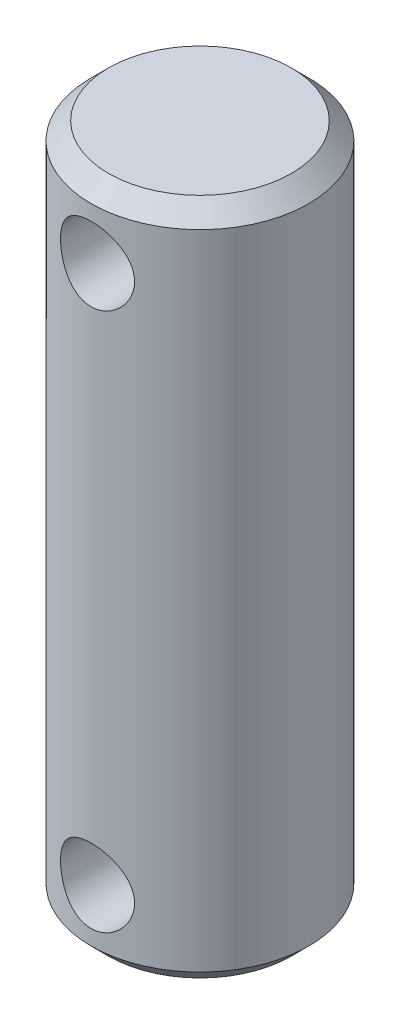
ISO-10303-21;
HEADER;
FILE_DESCRIPTION(('STEP AP214'),'2;1');
FILE_NAME('part.step','',(''),(''),'','','');
FILE_SCHEMA(('AUTOMOTIVE_DESIGN { 1 0 10303 214 1 1 1 1 }'));
ENDSEC;
DATA;
#1=APPLICATION_CONTEXT('core data for automotive mechanical design processes');
#2=APPLICATION_PROTOCOL_DEFINITION('international standard','automotive_design',2000,#1);
#3=PRODUCT_CONTEXT('',#1,'mechanical');
#4=PRODUCT('Part','Part','',(#3));
#5=PRODUCT_RELATED_PRODUCT_CATEGORY('part','',(#4));
#6=PRODUCT_DEFINITION_FORMATION('','',#4);
#7=PRODUCT_DEFINITION_CONTEXT('part definition',#1,'design');
#8=PRODUCT_DEFINITION('design','',#6,#7);
#9=PRODUCT_DEFINITION_SHAPE('','',#8);
#10=(LENGTH_UNIT() NAMED_UNIT(*) SI_UNIT(.MILLI.,.METRE.));
#11=(NAMED_UNIT(*) PLANE_ANGLE_UNIT() SI_UNIT($,.RADIAN.));
#12=(NAMED_UNIT(*) SI_UNIT($,.STERADIAN.) SOLID_ANGLE_UNIT());
#13=UNCERTAINTY_MEASURE_WITH_UNIT(LENGTH_MEASURE(1.E-05),#10,'distance_accuracy_value','');
#14=(GEOMETRIC_REPRESENTATION_CONTEXT(3) GLOBAL_UNCERTAINTY_ASSIGNED_CONTEXT((#13)) GLOBAL_UNIT_ASSIGNED_CONTEXT((#10,
#11,#12)) REPRESENTATION_CONTEXT('',''));
#15=CARTESIAN_POINT('',(0.,0.,0.));
#16=DIRECTION('',(0.,0.,1.));
#17=DIRECTION('',(1.,0.,0.));
#18=AXIS2_PLACEMENT_3D('',#15,#16,#17);
#19=CARTESIAN_POINT('',(0.,38.91,0.));
#20=DIRECTION('',(0.,-1.,0.));
#21=DIRECTION('',(0.,0.,-1.));
#22=AXIS2_PLACEMENT_3D('',#19,#20,#21);
#23=CYLINDRICAL_SURFACE('',#22,12.5);
#24=CARTESIAN_POINT('',(0.,35.16,-12.5));
#25=CARTESIAN_POINT('',(-0.231629316585797,35.1600020330341,-12.5000013493631));
#26=CARTESIAN_POINT('',(-0.463244602260156,35.1410026670462,-12.493502868787));
#27=CARTESIAN_POINT('',(-0.919637198733394,35.0657510509299,-12.4682205879803));
#28=CARTESIAN_POINT('',(-1.14441406994913,35.0094964112488,-12.4494359997198));
#29=CARTESIAN_POINT('',(-1.58048439723264,34.8618965380055,-12.4016188733298));
#30=CARTESIAN_POINT('',(-1.79180021823001,34.770611378287,-12.3726038861914));
#31=CARTESIAN_POINT('',(-2.1961203899874,34.5558184811844,-12.3072763657775));
#32=CARTESIAN_POINT('',(-2.38912089291743,34.4323039931499,-12.270962304028));
#33=CARTESIAN_POINT('',(-2.75825261944735,34.1519106918981,-12.1933910285169));
#34=CARTESIAN_POINT('',(-2.93363688121843,33.9940824421219,-12.1520119725704));
#35=CARTESIAN_POINT('',(-3.25602333800847,33.6515597009182,-12.069633438027));
#36=CARTESIAN_POINT('',(-3.40301894005995,33.4668589860642,-12.0286340497037));
#37=CARTESIAN_POINT('',(-3.66879190776175,33.0690227206061,-11.9503048632061));
#38=CARTESIAN_POINT('',(-3.78658554363525,32.8551980705236,-11.9131228611846));
#39=CARTESIAN_POINT('',(-3.98421855180598,32.409305339374,-11.8484975327096));
#40=CARTESIAN_POINT('',(-4.06407004270031,32.1772431109649,-11.8210510974587));
#41=CARTESIAN_POINT('',(-4.180727158555,31.7099754672721,-11.7802904138908));
#42=CARTESIAN_POINT('',(-4.21893677153849,31.4751618601511,-11.7665167255043));
#43=CARTESIAN_POINT('',(-4.2556150496915,31.0020834933359,-11.7533040945085));
#44=CARTESIAN_POINT('',(-4.25409658909983,30.7638198766629,-11.7538605081001));
#45=CARTESIAN_POINT('',(-4.21244934024964,30.3027050541706,-11.7688435667819));
#46=CARTESIAN_POINT('',(-4.1741694203804,30.0796614961546,-11.7826060062583));
#47=CARTESIAN_POINT('',(-4.06310816523945,29.643374512476,-11.8213609901718));
#48=CARTESIAN_POINT('',(-3.99032254229152,29.4301323083421,-11.8463549302143));
#49=CARTESIAN_POINT('',(-3.81113653039608,29.0153676287839,-11.9052184288415));
#50=CARTESIAN_POINT('',(-3.70419900732798,28.8140979714414,-11.9392282253861));
#51=CARTESIAN_POINT('',(-3.46011773998614,28.4317829261275,-12.0122344758094));
#52=CARTESIAN_POINT('',(-3.3229649914025,28.2507435911989,-12.0512324147271));
#53=CARTESIAN_POINT('',(-3.01353124215082,27.903661489716,-12.1324166416207));
#54=CARTESIAN_POINT('',(-2.83974395035441,27.7389723564576,-12.1746609041245));
#55=CARTESIAN_POINT('',(-2.4665017699171,27.440714672255,-12.2557250188891));
#56=CARTESIAN_POINT('',(-2.26704421977735,27.307149352277,-12.294544515365));
#57=CARTESIAN_POINT('',(-1.84516436753421,27.0737817200249,-12.3649312356261));
#58=CARTESIAN_POINT('',(-1.62251944687187,26.9743554382244,-12.3964165316577));
#59=CARTESIAN_POINT('',(-1.16233553494295,26.8147926289126,-12.4479909440337));
#60=CARTESIAN_POINT('',(-0.924801969927403,26.7546418774178,-12.4680841857644));
#61=CARTESIAN_POINT('',(-0.453032806948608,26.6777666520223,-12.4939206883818));
#62=CARTESIAN_POINT('',(-0.219127772365222,26.6592140835185,-12.5002675966187));
#63=CARTESIAN_POINT('',(0.248508234272233,26.6608366933351,-12.499715139365));
#64=CARTESIAN_POINT('',(0.482239229767981,26.6810050341146,-12.4928181125577));
#65=CARTESIAN_POINT('',(0.935487055917024,26.7580582339634,-12.4669514589193));
#66=CARTESIAN_POINT('',(1.15521999196989,26.8138095457653,-12.4483547937561));
#67=CARTESIAN_POINT('',(1.58211571473707,26.959017457826,-12.4013331971436));
#68=CARTESIAN_POINT('',(1.78927688332145,27.048478386259,-12.3729070036624));
#69=CARTESIAN_POINT('',(2.19135854363444,27.2612234537794,-12.3081499547371));
#70=CARTESIAN_POINT('',(2.38580051143911,27.385351890635,-12.2716272117682));
#71=CARTESIAN_POINT('',(2.75168306551547,27.6629228847875,-12.1948041286534));
#72=CARTESIAN_POINT('',(2.92311635003781,27.8163747105205,-12.1545025961777));
#73=CARTESIAN_POINT('',(3.24657351287904,28.1568275664985,-12.0722386132383));
#74=CARTESIAN_POINT('',(3.39729328842666,28.345073487899,-12.0302879182072));
#75=CARTESIAN_POINT('',(3.66518020873976,28.7450778779993,-11.9514023496921));
#76=CARTESIAN_POINT('',(3.78234674334563,28.9568367741812,-11.914467567428));
#77=CARTESIAN_POINT('',(3.97933669538634,29.3981566802981,-11.8501336294714));
#78=CARTESIAN_POINT('',(4.05920753889126,29.627694646285,-11.8227223748612));
#79=CARTESIAN_POINT('',(4.1787762904475,30.0981175672848,-11.7809981443993));
#80=CARTESIAN_POINT('',(4.21849327320324,30.3389970776366,-11.7666789496003));
#81=CARTESIAN_POINT('',(4.2551029021973,30.8114252701727,-11.7534862510052));
#82=CARTESIAN_POINT('',(4.2541688433069,31.042785450644,-11.7538288765012));
#83=CARTESIAN_POINT('',(4.21488538095235,31.5018665676405,-11.7679720866019));
#84=CARTESIAN_POINT('',(4.17653837981658,31.7295877368765,-11.781771807111));
#85=CARTESIAN_POINT('',(4.06508169516974,32.1702486699102,-11.8206793925214));
#86=CARTESIAN_POINT('',(3.99270334550051,32.3833961386628,-11.8455487968498));
#87=CARTESIAN_POINT('',(3.81583792726954,32.7946811689962,-11.9036971533386));
#88=CARTESIAN_POINT('',(3.71134355482286,32.9928153034268,-11.9369780181425));
#89=CARTESIAN_POINT('',(3.46772073523882,33.3781337048613,-12.0100690469571));
#90=CARTESIAN_POINT('',(3.32724348872325,33.5644218744554,-12.0501058971147));
#91=CARTESIAN_POINT('',(3.0178925601542,33.9114819910172,-12.1312763731794));
#92=CARTESIAN_POINT('',(2.84901069833453,34.072246561876,-12.1724103121393));
#93=CARTESIAN_POINT('',(2.4793015879225,34.3703796450803,-12.2531734329683));
#94=CARTESIAN_POINT('',(2.2774454476222,34.5065125530158,-12.2926709568964));
#95=CARTESIAN_POINT('',(1.85239769842136,34.7427805226005,-12.3638575017702));
#96=CARTESIAN_POINT('',(1.62921053671336,34.8429230670564,-12.3955481454238));
#97=CARTESIAN_POINT('',(1.1749855410373,35.0011995465962,-12.4466848305204));
#98=CARTESIAN_POINT('',(0.944413374480445,35.0605523489214,-12.4664836857426));
#99=CARTESIAN_POINT('',(0.475887689244039,35.1399455427374,-12.4931386057906));
#100=CARTESIAN_POINT('',(0.237936441911583,35.1599979116076,-12.4999986138946));
#101=CARTESIAN_POINT('',(0.,35.16,-12.5));
#102=B_SPLINE_CURVE_WITH_KNOTS('',3,(#24,#25,#26,#27,#28,#29,#30,#31,#32,#33,#34,#35,#36,#37,
#38,#39,#40,#41,#42,#43,#44,#45,#46,#47,#48,#49,#50,#51,#52,#53,#54,#55,#56,#57,#58,#59,#60,#61,
#62,#63,#64,#65,#66,#67,#68,#69,#70,#71,#72,#73,#74,#75,#76,#77,#78,#79,#80,#81,#82,#83,#84,#85,
#86,#87,#88,#89,#90,#91,#92,#93,#94,#95,#96,#97,#98,#99,#100,#101),.UNSPECIFIED.,.T.,.F.,(4,2,2,
2,2,2,2,2,2,2,2,2,2,2,2,2,2,2,2,2,2,2,2,2,2,2,2,2,2,2,2,2,2,2,2,2,2,2,4),(0.,0.694012031135522,
1.38806858050573,2.08094017307814,2.77395700894338,3.48937549744916,4.20495993509719,
4.94210626785765,5.67901699996315,6.39023024980915,7.10121302747361,7.77821403353031,
8.45529918574264,9.14360628251112,9.83211877686468,10.558127208264,11.2842109731308,
12.0180534127162,12.7516299370932,13.4522781499046,14.1528026499667,14.8320547208526,
15.5113940346079,16.2089885679879,16.9068039604599,17.6376748123879,18.368558954226,
19.0985111385898,19.8281164030437,20.5187658396099,21.2093709316938,21.8857695188883,
22.5623220478608,23.2693695244284,23.976620961389,24.7129879656022,25.4492017820333,
26.1623287080454,26.8752382644273),.UNSPECIFIED.);
#103=CARTESIAN_POINT('',(0.,35.16,-12.5));
#104=VERTEX_POINT('',#103);
#105=EDGE_CURVE('E48',#104,#104,#102,.T.);
#106=ORIENTED_EDGE('',*,*,#105,.T.);
#107=EDGE_LOOP('',(#106));
#108=FACE_BOUND('',#107,.T.);
#109=CARTESIAN_POINT('',(4.25,30.91,11.7553179455087));
#110=CARTESIAN_POINT('',(4.25000208635938,30.6788082243958,11.7553163048564));
#111=CARTESIAN_POINT('',(4.23107177309128,30.4476306111017,11.7622127031611));
#112=CARTESIAN_POINT('',(4.15611937649357,29.9921430943685,11.7889024426549));
#113=CARTESIAN_POINT('',(4.10009241001671,29.7678340991343,11.8086974817267));
#114=CARTESIAN_POINT('',(3.95315727615972,29.3327597886088,11.8586887228588));
#115=CARTESIAN_POINT('',(3.86231972243053,29.1219680573483,11.8888638561852));
#116=CARTESIAN_POINT('',(3.64858465717113,28.7185451145788,11.9561841704273));
#117=CARTESIAN_POINT('',(3.52567963418154,28.5259181723876,11.9933309838111));
#118=CARTESIAN_POINT('',(3.24593667986677,28.1564478386544,12.0721055733369));
#119=CARTESIAN_POINT('',(3.08801191357713,27.9804516300864,12.1138482614208));
#120=CARTESIAN_POINT('',(2.74502977872382,27.6568608782459,12.1961419607755));
#121=CARTESIAN_POINT('',(2.55996786105974,27.5092711064602,12.2366927708767));
#122=CARTESIAN_POINT('',(2.16173358215593,27.242803063851,12.3133695834904));
#123=CARTESIAN_POINT('',(1.9479322684075,27.1248175164114,12.3493447648353));
#124=CARTESIAN_POINT('',(1.50208314069309,26.9268239888865,12.4114588114545));
#125=CARTESIAN_POINT('',(1.27004047751297,26.8468053327207,12.4376004414402));
#126=CARTESIAN_POINT('',(0.803181808925198,26.729904815012,12.4762877361144));
#127=CARTESIAN_POINT('',(0.568768024092832,26.691570565411,12.4892899687544));
#128=CARTESIAN_POINT('',(0.096498681332753,26.6545035304582,12.5018568685094));
#129=CARTESIAN_POINT('',(-0.141355937364764,26.6557601346843,12.5014251359524));
#130=CARTESIAN_POINT('',(-0.603455244429959,26.6969293778599,12.4874792686763));
#131=CARTESIAN_POINT('',(-0.827859366125013,26.7352633639397,12.474499409838));
#132=CARTESIAN_POINT('',(-1.26683563867679,26.8468817672938,12.4375910854643));
#133=CARTESIAN_POINT('',(-1.48140711554011,26.9201685765457,12.4136618706201));
#134=CARTESIAN_POINT('',(-1.8980164033555,27.1005041300386,12.3568751775078));
#135=CARTESIAN_POINT('',(-2.09984758406958,27.2079923868106,12.3239022889639));
#136=CARTESIAN_POINT('',(-2.48306659203639,27.4533137607319,12.2524460502634));
#137=CARTESIAN_POINT('',(-2.66444855405648,27.591155550554,12.2139611262977));
#138=CARTESIAN_POINT('',(-3.01099992399038,27.9011745301492,12.1333048225972));
#139=CARTESIAN_POINT('',(-3.17494418986543,28.0747002678062,12.0910451976412));
#140=CARTESIAN_POINT('',(-3.4718123267595,28.447127612344,12.0091752957356));
#141=CARTESIAN_POINT('',(-3.60473100646118,28.6460334573203,11.969565462949));
#142=CARTESIAN_POINT('',(-3.83756473071074,29.0675999287105,11.8969851778806));
#143=CARTESIAN_POINT('',(-3.93694148373781,29.2905784989992,11.8641260508176));
#144=CARTESIAN_POINT('',(-4.09631339640206,29.751505720852,11.8100543141711));
#145=CARTESIAN_POINT('',(-4.15632586418346,29.9894477426114,11.7888365866345));
#146=CARTESIAN_POINT('',(-4.23272709729825,30.461640096284,11.7616154920121));
#147=CARTESIAN_POINT('',(-4.25102291540232,30.6955435602831,11.7549476419358));
#148=CARTESIAN_POINT('',(-4.24888913268011,31.163124045222,11.7557200468072));
#149=CARTESIAN_POINT('',(-4.22846693505826,31.3968011009053,11.7631576046845));
#150=CARTESIAN_POINT('',(-4.15119312232908,31.8484588804628,11.790638359865));
#151=CARTESIAN_POINT('',(-4.09568855042672,32.0667015418879,11.8102149538794));
#152=CARTESIAN_POINT('',(-3.9514537893724,32.4907242875293,11.8592485003546));
#153=CARTESIAN_POINT('',(-3.86271756175014,32.6965020988783,11.888707248384));
#154=CARTESIAN_POINT('',(-3.65124748009679,33.0972093806727,11.9553766913527));
#155=CARTESIAN_POINT('',(-3.52749746510955,33.2915646574045,11.9928092351957));
#156=CARTESIAN_POINT('',(-3.25065304738288,33.6574387202912,12.0707872460142));
#157=CARTESIAN_POINT('',(-3.09754966045709,33.8289504874256,12.1113336637695));
#158=CARTESIAN_POINT('',(-2.75718975144257,34.1532047947156,12.1934414759765));
#159=CARTESIAN_POINT('',(-2.56860120561712,34.3045664440502,12.2349510943746));
#160=CARTESIAN_POINT('',(-2.16767839127811,34.5735958933644,12.3123024299383));
#161=CARTESIAN_POINT('',(-1.9553448608948,34.6912647403048,12.3481443232058));
#162=CARTESIAN_POINT('',(-1.51390748124952,34.8885220351902,12.4099713333259));
#163=CARTESIAN_POINT('',(-1.28491760269165,34.9683455126643,12.4360170721838));
#164=CARTESIAN_POINT('',(-0.81569900239732,35.0880013666957,12.4755748071516));
#165=CARTESIAN_POINT('',(-0.575474556193985,35.1278488293486,12.489091531298));
#166=CARTESIAN_POINT('',(-0.103211830111089,35.1650209742181,12.50169717107));
#167=CARTESIAN_POINT('',(0.128654421017074,35.1643244388139,12.501457487594));
#168=CARTESIAN_POINT('',(0.588812496753035,35.1253415064129,12.4882452162174));
#169=CARTESIAN_POINT('',(0.817104629585829,35.087058369155,12.4752737324961));
#170=CARTESIAN_POINT('',(1.25973733436524,34.9753164091026,12.438311718123));
#171=CARTESIAN_POINT('',(1.47424962273104,34.9024696892469,12.4145132190251));
#172=CARTESIAN_POINT('',(1.88808156366101,34.7242408217571,12.3583495347409));
#173=CARTESIAN_POINT('',(2.08739842506849,34.6188527146591,12.3259827805629));
#174=CARTESIAN_POINT('',(2.47341490547125,34.3739468867196,12.2544776933187));
#175=CARTESIAN_POINT('',(2.65935109194141,34.2332880355071,12.2151293747917));
#176=CARTESIAN_POINT('',(3.0056225058322,33.9237518219909,12.1345744052391));
#177=CARTESIAN_POINT('',(3.16594936631593,33.7548652740194,12.0933671524889));
#178=CARTESIAN_POINT('',(3.46317770167238,33.3853569274188,12.0117094140378));
#179=CARTESIAN_POINT('',(3.59884229876753,33.1837145025818,11.9713600094017));
#180=CARTESIAN_POINT('',(3.83428262236864,32.7592278836957,11.8980483180312));
#181=CARTESIAN_POINT('',(3.93406590564969,32.5363881664128,11.865084476414));
#182=CARTESIAN_POINT('',(4.0917578844551,32.0829356054837,11.8116162303556));
#183=CARTESIAN_POINT('',(4.15089676108841,31.8527949668864,11.7907491035731));
#184=CARTESIAN_POINT('',(4.23000923378121,31.3850959809143,11.7626034107323));
#185=CARTESIAN_POINT('',(4.24999785634727,31.1475405150521,11.7553196312149));
#186=CARTESIAN_POINT('',(4.25,30.91,11.7553179455087));
#187=B_SPLINE_CURVE_WITH_KNOTS('',3,(#109,#110,#111,#112,#113,#114,#115,#116,#117,#118,#119,
#120,#121,#122,#123,#124,#125,#126,#127,#128,#129,#130,#131,#132,#133,#134,#135,#136,#137,#138,
#139,#140,#141,#142,#143,#144,#145,#146,#147,#148,#149,#150,#151,#152,#153,#154,#155,#156,#157,
#158,#159,#160,#161,#162,#163,#164,#165,#166,#167,#168,#169,#170,#171,#172,#173,#174,#175,#176,
#177,#178,#179,#180,#181,#182,#183,#184,#185,#186),.UNSPECIFIED.,.T.,.F.,(4,2,2,2,2,2,2,2,2,2,2,
2,2,2,2,2,2,2,2,2,2,2,2,2,2,2,2,2,2,2,2,2,2,2,2,2,2,2,4),(0.,0.692694920384618,1.38548104047712,
2.07686921235574,2.76841948009047,3.48554525708903,4.20279138623515,4.93959691860359,
5.67619514235265,6.38621339082408,7.09604135470939,7.77691942027095,8.45784408804076,
9.14789875658826,9.83815084536889,10.5621283168264,11.2862268402086,12.0214474433795,
12.7563445591683,13.456908323454,14.1573381476705,14.8323840278356,15.5075526290563,
16.2047830406201,16.9022271951569,17.6348081128836,18.3673662641226,19.0953134364972,
19.8229857936747,20.515174766614,21.2073037140138,21.8876085563469,22.5680380602091,
23.2742297793021,23.9806517515895,24.7161707244756,25.4515347027242,26.1635249917672,
26.8752419537226),.UNSPECIFIED.);
#188=CARTESIAN_POINT('',(4.25,30.91,11.7553179455087));
#189=VERTEX_POINT('',#188);
#190=EDGE_CURVE('E108',#189,#189,#187,.T.);
#191=ORIENTED_EDGE('',*,*,#190,.T.);
#192=EDGE_LOOP('',(#191));
#193=FACE_BOUND('',#192,.T.);
#194=CARTESIAN_POINT('',(0.,-26.66,-12.5));
#195=CARTESIAN_POINT('',(-0.231629316585798,-26.6599979669659,-12.5000013493631));
#196=CARTESIAN_POINT('',(-0.463244602260157,-26.6789973329538,-12.493502868787));
#197=CARTESIAN_POINT('',(-0.919637198733394,-26.7542489490701,-12.4682205879803));
#198=CARTESIAN_POINT('',(-1.14441406994913,-26.8105035887512,-12.4494359997198));
#199=CARTESIAN_POINT('',(-1.58048439723264,-26.9581034619945,-12.4016188733298));
#200=CARTESIAN_POINT('',(-1.79180021823001,-27.049388621713,-12.3726038861914));
#201=CARTESIAN_POINT('',(-2.1961203899874,-27.2641815188156,-12.3072763657775));
#202=CARTESIAN_POINT('',(-2.38912089291743,-27.3876960068501,-12.270962304028));
#203=CARTESIAN_POINT('',(-2.75825261944734,-27.6680893081019,-12.1933910285169));
#204=CARTESIAN_POINT('',(-2.93363688121842,-27.8259175578781,-12.1520119725704));
#205=CARTESIAN_POINT('',(-3.25602333800846,-28.1684402990818,-12.069633438027));
#206=CARTESIAN_POINT('',(-3.40301894005994,-28.3531410139358,-12.0286340497037));
#207=CARTESIAN_POINT('',(-3.66879190776174,-28.7509772793939,-11.9503048632061));
#208=CARTESIAN_POINT('',(-3.78658554363524,-28.9648019294764,-11.9131228611846));
#209=CARTESIAN_POINT('',(-3.98421855180598,-29.410694660626,-11.8484975327096));
#210=CARTESIAN_POINT('',(-4.06407004270031,-29.6427568890351,-11.8210510974587));
#211=CARTESIAN_POINT('',(-4.180727158555,-30.1100245327279,-11.7802904138908));
#212=CARTESIAN_POINT('',(-4.21893677153849,-30.3448381398489,-11.7665167255043));
#213=CARTESIAN_POINT('',(-4.2556150496915,-30.8179165066641,-11.7533040945085));
#214=CARTESIAN_POINT('',(-4.25409658909983,-31.0561801233371,-11.7538605081001));
#215=CARTESIAN_POINT('',(-4.21244934024964,-31.5172949458294,-11.7688435667819));
#216=CARTESIAN_POINT('',(-4.1741694203804,-31.7403385038454,-11.7826060062583));
#217=CARTESIAN_POINT('',(-4.06310816523945,-32.176625487524,-11.8213609901718));
#218=CARTESIAN_POINT('',(-3.99032254229152,-32.3898676916579,-11.8463549302143));
#219=CARTESIAN_POINT('',(-3.81113653039608,-32.8046323712161,-11.9052184288415));
#220=CARTESIAN_POINT('',(-3.70419900732798,-33.0059020285586,-11.9392282253861));
#221=CARTESIAN_POINT('',(-3.46011773998614,-33.3882170738725,-12.0122344758094));
#222=CARTESIAN_POINT('',(-3.32296499140251,-33.5692564088011,-12.0512324147271));
#223=CARTESIAN_POINT('',(-3.01353124215082,-33.916338510284,-12.1324166416207));
#224=CARTESIAN_POINT('',(-2.83974395035441,-34.0810276435424,-12.1746609041245));
#225=CARTESIAN_POINT('',(-2.46650176991709,-34.379285327745,-12.2557250188891));
#226=CARTESIAN_POINT('',(-2.26704421977735,-34.512850647723,-12.294544515365));
#227=CARTESIAN_POINT('',(-1.84516436753422,-34.7462182799751,-12.3649312356261));
#228=CARTESIAN_POINT('',(-1.62251944687188,-34.8456445617756,-12.3964165316577));
#229=CARTESIAN_POINT('',(-1.16233553494295,-35.0052073710874,-12.4479909440337));
#230=CARTESIAN_POINT('',(-0.924801969927408,-35.0653581225822,-12.4680841857644));
#231=CARTESIAN_POINT('',(-0.453032806948613,-35.1422333479777,-12.4939206883818));
#232=CARTESIAN_POINT('',(-0.219127772365227,-35.1607859164815,-12.5002675966187));
#233=CARTESIAN_POINT('',(0.248508234272228,-35.1591633066649,-12.499715139365));
#234=CARTESIAN_POINT('',(0.482239229767976,-35.1389949658854,-12.4928181125577));
#235=CARTESIAN_POINT('',(0.935487055917019,-35.0619417660366,-12.4669514589193));
#236=CARTESIAN_POINT('',(1.15521999196989,-35.0061904542347,-12.4483547937561));
#237=CARTESIAN_POINT('',(1.58211571473706,-34.860982542174,-12.4013331971436));
#238=CARTESIAN_POINT('',(1.78927688332144,-34.771521613741,-12.3729070036624));
#239=CARTESIAN_POINT('',(2.19135854363443,-34.5587765462206,-12.3081499547371));
#240=CARTESIAN_POINT('',(2.3858005114391,-34.434648109365,-12.2716272117682));
#241=CARTESIAN_POINT('',(2.75168306551547,-34.1570771152126,-12.1948041286534));
#242=CARTESIAN_POINT('',(2.9231163500378,-34.0036252894795,-12.1545025961777));
#243=CARTESIAN_POINT('',(3.24657351287904,-33.6631724335015,-12.0722386132383));
#244=CARTESIAN_POINT('',(3.39729328842666,-33.474926512101,-12.0302879182072));
#245=CARTESIAN_POINT('',(3.66518020873975,-33.0749221220007,-11.9514023496921));
#246=CARTESIAN_POINT('',(3.78234674334563,-32.8631632258188,-11.914467567428));
#247=CARTESIAN_POINT('',(3.97933669538634,-32.4218433197019,-11.8501336294714));
#248=CARTESIAN_POINT('',(4.05920753889126,-32.192305353715,-11.8227223748612));
#249=CARTESIAN_POINT('',(4.17877629044749,-31.7218824327152,-11.7809981443993));
#250=CARTESIAN_POINT('',(4.21849327320324,-31.4810029223634,-11.7666789496003));
#251=CARTESIAN_POINT('',(4.2551029021973,-31.0085747298273,-11.7534862510052));
#252=CARTESIAN_POINT('',(4.2541688433069,-30.777214549356,-11.7538288765012));
#253=CARTESIAN_POINT('',(4.21488538095235,-30.3181334323595,-11.7679720866019));
#254=CARTESIAN_POINT('',(4.17653837981658,-30.0904122631235,-11.781771807111));
#255=CARTESIAN_POINT('',(4.06508169516974,-29.6497513300898,-11.8206793925214));
#256=CARTESIAN_POINT('',(3.99270334550051,-29.4366038613372,-11.8455487968498));
#257=CARTESIAN_POINT('',(3.81583792726955,-29.0253188310038,-11.9036971533386));
#258=CARTESIAN_POINT('',(3.71134355482286,-28.8271846965732,-11.9369780181425));
#259=CARTESIAN_POINT('',(3.46772073523882,-28.4418662951387,-12.0100690469571));
#260=CARTESIAN_POINT('',(3.32724348872325,-28.2555781255446,-12.0501058971147));
#261=CARTESIAN_POINT('',(3.0178925601542,-27.9085180089828,-12.1312763731794));
#262=CARTESIAN_POINT('',(2.84901069833453,-27.747753438124,-12.1724103121393));
#263=CARTESIAN_POINT('',(2.4793015879225,-27.4496203549197,-12.2531734329683));
#264=CARTESIAN_POINT('',(2.2774454476222,-27.3134874469842,-12.2926709568964));
#265=CARTESIAN_POINT('',(1.85239769842136,-27.0772194773995,-12.3638575017702));
#266=CARTESIAN_POINT('',(1.62921053671336,-26.9770769329437,-12.3955481454238));
#267=CARTESIAN_POINT('',(1.17498554103731,-26.8188004534038,-12.4466848305204));
#268=CARTESIAN_POINT('',(0.944413374480449,-26.7594476510786,-12.4664836857426));
#269=CARTESIAN_POINT('',(0.475887689244042,-26.6800544572626,-12.4931386057906));
#270=CARTESIAN_POINT('',(0.237936441911584,-26.6600020883924,-12.4999986138946));
#271=CARTESIAN_POINT('',(0.,-26.66,-12.5));
#272=B_SPLINE_CURVE_WITH_KNOTS('',3,(#194,#195,#196,#197,#198,#199,#200,#201,#202,#203,#204,
#205,#206,#207,#208,#209,#210,#211,#212,#213,#214,#215,#216,#217,#218,#219,#220,#221,#222,#223,
#224,#225,#226,#227,#228,#229,#230,#231,#232,#233,#234,#235,#236,#237,#238,#239,#240,#241,#242,
#243,#244,#245,#246,#247,#248,#249,#250,#251,#252,#253,#254,#255,#256,#257,#258,#259,#260,#261,
#262,#263,#264,#265,#266,#267,#268,#269,#270,#271),.UNSPECIFIED.,.T.,.F.,(4,2,2,2,2,2,2,2,2,2,2,
2,2,2,2,2,2,2,2,2,2,2,2,2,2,2,2,2,2,2,2,2,2,2,2,2,2,2,4),(0.,0.694012031135522,1.38806858050573,
2.08094017307814,2.77395700894338,3.48937549744916,4.20495993509719,4.94210626785764,
5.67901699996315,6.39023024980915,7.10121302747361,7.77821403353032,8.45529918574265,
9.14360628251112,9.83211877686468,10.5581272082641,11.2842109731308,12.0180534127162,
12.7516299370932,13.4522781499046,14.1528026499667,14.8320547208526,15.5113940346079,
16.2089885679879,16.9068039604599,17.6376748123879,18.368558954226,19.0985111385898,
19.8281164030437,20.5187658396099,21.2093709316938,21.8857695188883,22.5623220478608,
23.2693695244284,23.976620961389,24.7129879656022,25.4492017820333,26.1623287080454,
26.8752382644273),.UNSPECIFIED.);
#273=CARTESIAN_POINT('',(0.,-26.66,-12.5));
#274=VERTEX_POINT('',#273);
#275=EDGE_CURVE('E73',#274,#274,#272,.T.);
#276=ORIENTED_EDGE('',*,*,#275,.T.);
#277=EDGE_LOOP('',(#276));
#278=FACE_BOUND('',#277,.T.);
#279=CARTESIAN_POINT('',(4.25,-30.91,11.7553179455087));
#280=CARTESIAN_POINT('',(4.25000208635938,-31.1411917756042,11.7553163048564));
#281=CARTESIAN_POINT('',(4.23107177309128,-31.3723693888983,11.7622127031611));
#282=CARTESIAN_POINT('',(4.15611937649357,-31.8278569056315,11.7889024426549));
#283=CARTESIAN_POINT('',(4.10009241001671,-32.0521659008657,11.8086974817267));
#284=CARTESIAN_POINT('',(3.95315727615972,-32.4872402113912,11.8586887228588));
#285=CARTESIAN_POINT('',(3.86231972243054,-32.6980319426517,11.8888638561852));
#286=CARTESIAN_POINT('',(3.64858465717114,-33.1014548854212,11.9561841704273));
#287=CARTESIAN_POINT('',(3.52567963418154,-33.2940818276124,11.9933309838111));
#288=CARTESIAN_POINT('',(3.24593667986677,-33.6635521613456,12.0721055733369));
#289=CARTESIAN_POINT('',(3.08801191357714,-33.8395483699136,12.1138482614208));
#290=CARTESIAN_POINT('',(2.74502977872382,-34.1631391217541,12.1961419607755));
#291=CARTESIAN_POINT('',(2.55996786105974,-34.3107288935398,12.2366927708767));
#292=CARTESIAN_POINT('',(2.16173358215593,-34.577196936149,12.3133695834904));
#293=CARTESIAN_POINT('',(1.9479322684075,-34.6951824835886,12.3493447648353));
#294=CARTESIAN_POINT('',(1.50208314069309,-34.8931760111135,12.4114588114545));
#295=CARTESIAN_POINT('',(1.27004047751297,-34.9731946672793,12.4376004414402));
#296=CARTESIAN_POINT('',(0.803181808925197,-35.090095184988,12.4762877361144));
#297=CARTESIAN_POINT('',(0.568768024092831,-35.128429434589,12.4892899687544));
#298=CARTESIAN_POINT('',(0.0964986813327526,-35.1654964695418,12.5018568685094));
#299=CARTESIAN_POINT('',(-0.141355937364764,-35.1642398653157,12.5014251359524));
#300=CARTESIAN_POINT('',(-0.603455244429959,-35.1230706221401,12.4874792686763));
#301=CARTESIAN_POINT('',(-0.827859366125015,-35.0847366360603,12.474499409838));
#302=CARTESIAN_POINT('',(-1.26683563867679,-34.9731182327062,12.4375910854643));
#303=CARTESIAN_POINT('',(-1.48140711554011,-34.8998314234543,12.4136618706201));
#304=CARTESIAN_POINT('',(-1.8980164033555,-34.7194958699614,12.3568751775078));
#305=CARTESIAN_POINT('',(-2.09984758406958,-34.6120076131894,12.3239022889639));
#306=CARTESIAN_POINT('',(-2.48306659203639,-34.3666862392681,12.2524460502634));
#307=CARTESIAN_POINT('',(-2.66444855405648,-34.228844449446,12.2139611262977));
#308=CARTESIAN_POINT('',(-3.01099992399037,-33.9188254698508,12.1333048225972));
#309=CARTESIAN_POINT('',(-3.17494418986543,-33.7452997321938,12.0910451976412));
#310=CARTESIAN_POINT('',(-3.47181232675949,-33.372872387656,12.0091752957356));
#311=CARTESIAN_POINT('',(-3.60473100646118,-33.1739665426797,11.969565462949));
#312=CARTESIAN_POINT('',(-3.83756473071074,-32.7524000712895,11.8969851778806));
#313=CARTESIAN_POINT('',(-3.93694148373781,-32.5294215010008,11.8641260508176));
#314=CARTESIAN_POINT('',(-4.09631339640205,-32.068494279148,11.8100543141711));
#315=CARTESIAN_POINT('',(-4.15632586418345,-31.8305522573886,11.7888365866345));
#316=CARTESIAN_POINT('',(-4.23272709729825,-31.358359903716,11.7616154920121));
#317=CARTESIAN_POINT('',(-4.25102291540232,-31.1244564397169,11.7549476419358));
#318=CARTESIAN_POINT('',(-4.24888913268011,-30.656875954778,11.7557200468072));
#319=CARTESIAN_POINT('',(-4.22846693505826,-30.4231988990948,11.7631576046845));
#320=CARTESIAN_POINT('',(-4.15119312232908,-29.9715411195372,11.790638359865));
#321=CARTESIAN_POINT('',(-4.09568855042672,-29.7532984581121,11.8102149538794));
#322=CARTESIAN_POINT('',(-3.9514537893724,-29.3292757124707,11.8592485003546));
#323=CARTESIAN_POINT('',(-3.86271756175014,-29.1234979011217,11.888707248384));
#324=CARTESIAN_POINT('',(-3.65124748009679,-28.7227906193273,11.9553766913527));
#325=CARTESIAN_POINT('',(-3.52749746510955,-28.5284353425955,11.9928092351957));
#326=CARTESIAN_POINT('',(-3.25065304738288,-28.1625612797088,12.0707872460142));
#327=CARTESIAN_POINT('',(-3.09754966045709,-27.9910495125744,12.1113336637695));
#328=CARTESIAN_POINT('',(-2.75718975144257,-27.6667952052844,12.1934414759765));
#329=CARTESIAN_POINT('',(-2.56860120561712,-27.5154335559498,12.2349510943746));
#330=CARTESIAN_POINT('',(-2.16767839127811,-27.2464041066356,12.3123024299383));
#331=CARTESIAN_POINT('',(-1.9553448608948,-27.1287352596952,12.3481443232058));
#332=CARTESIAN_POINT('',(-1.51390748124952,-26.9314779648098,12.4099713333259));
#333=CARTESIAN_POINT('',(-1.28491760269165,-26.8516544873357,12.4360170721838));
#334=CARTESIAN_POINT('',(-0.81569900239732,-26.7319986333043,12.4755748071516));
#335=CARTESIAN_POINT('',(-0.575474556193985,-26.6921511706514,12.489091531298));
#336=CARTESIAN_POINT('',(-0.103211830111091,-26.6549790257819,12.50169717107));
#337=CARTESIAN_POINT('',(0.128654421017071,-26.6556755611861,12.501457487594));
#338=CARTESIAN_POINT('',(0.588812496753033,-26.6946584935871,12.4882452162174));
#339=CARTESIAN_POINT('',(0.817104629585828,-26.732941630845,12.4752737324961));
#340=CARTESIAN_POINT('',(1.25973733436524,-26.8446835908974,12.438311718123));
#341=CARTESIAN_POINT('',(1.47424962273104,-26.917530310753,12.4145132190251));
#342=CARTESIAN_POINT('',(1.88808156366101,-27.0957591782428,12.3583495347409));
#343=CARTESIAN_POINT('',(2.08739842506849,-27.2011472853409,12.3259827805629));
#344=CARTESIAN_POINT('',(2.47341490547125,-27.4460531132804,12.2544776933187));
#345=CARTESIAN_POINT('',(2.65935109194141,-27.5867119644929,12.2151293747917));
#346=CARTESIAN_POINT('',(3.00562250583219,-27.8962481780091,12.1345744052391));
#347=CARTESIAN_POINT('',(3.16594936631593,-28.0651347259806,12.0933671524889));
#348=CARTESIAN_POINT('',(3.46317770167239,-28.4346430725812,12.0117094140378));
#349=CARTESIAN_POINT('',(3.59884229876753,-28.6362854974182,11.9713600094017));
#350=CARTESIAN_POINT('',(3.83428262236865,-29.0607721163043,11.8980483180312));
#351=CARTESIAN_POINT('',(3.93406590564969,-29.2836118335872,11.865084476414));
#352=CARTESIAN_POINT('',(4.0917578844551,-29.7370643945163,11.8116162303556));
#353=CARTESIAN_POINT('',(4.15089676108841,-29.9672050331136,11.7907491035731));
#354=CARTESIAN_POINT('',(4.23000923378121,-30.4349040190857,11.7626034107323));
#355=CARTESIAN_POINT('',(4.24999785634726,-30.6724594849479,11.7553196312149));
#356=CARTESIAN_POINT('',(4.25,-30.91,11.7553179455087));
#357=B_SPLINE_CURVE_WITH_KNOTS('',3,(#279,#280,#281,#282,#283,#284,#285,#286,#287,#288,#289,
#290,#291,#292,#293,#294,#295,#296,#297,#298,#299,#300,#301,#302,#303,#304,#305,#306,#307,#308,
#309,#310,#311,#312,#313,#314,#315,#316,#317,#318,#319,#320,#321,#322,#323,#324,#325,#326,#327,
#328,#329,#330,#331,#332,#333,#334,#335,#336,#337,#338,#339,#340,#341,#342,#343,#344,#345,#346,
#347,#348,#349,#350,#351,#352,#353,#354,#355,#356),.UNSPECIFIED.,.T.,.F.,(4,2,2,2,2,2,2,2,2,2,2,
2,2,2,2,2,2,2,2,2,2,2,2,2,2,2,2,2,2,2,2,2,2,2,2,2,2,2,4),(0.,0.692694920384608,1.38548104047712,
2.07686921235573,2.76841948009047,3.48554525708903,4.20279138623515,4.93959691860359,
5.67619514235265,6.38621339082408,7.09604135470939,7.77691942027095,8.45784408804076,
9.14789875658826,9.83815084536889,10.5621283168264,11.2862268402086,12.0214474433795,
12.7563445591683,13.4569083234539,14.1573381476704,14.8323840278356,15.5075526290563,
16.2047830406201,16.9022271951569,17.6348081128836,18.3673662641226,19.0953134364972,
19.8229857936747,20.515174766614,21.2073037140138,21.8876085563469,22.5680380602091,
23.2742297793021,23.9806517515895,24.7161707244756,25.4515347027242,26.1635249917672,
26.8752419537226),.UNSPECIFIED.);
#358=CARTESIAN_POINT('',(4.25,-30.91,11.7553179455087));
#359=VERTEX_POINT('',#358);
#360=EDGE_CURVE('E66',#359,#359,#357,.T.);
#361=ORIENTED_EDGE('',*,*,#360,.T.);
#362=EDGE_LOOP('',(#361));
#363=FACE_BOUND('',#362,.T.);
#364=CARTESIAN_POINT('',(0.,-36.91,0.));
#365=DIRECTION('',(0.,1.,0.));
#366=DIRECTION('',(0.,0.,1.));
#367=AXIS2_PLACEMENT_3D('',#364,#365,#366);
#368=CIRCLE('',#367,12.5);
#369=CARTESIAN_POINT('',(0.,-36.91,12.5));
#370=VERTEX_POINT('',#369);
#371=EDGE_CURVE('E62',#370,#370,#368,.T.);
#372=ORIENTED_EDGE('',*,*,#371,.T.);
#373=EDGE_LOOP('',(#372));
#374=FACE_BOUND('',#373,.T.);
#375=CARTESIAN_POINT('',(0.,36.91,0.));
#376=DIRECTION('',(0.,1.,0.));
#377=DIRECTION('',(0.,0.,1.));
#378=AXIS2_PLACEMENT_3D('',#375,#376,#377);
#379=CIRCLE('',#378,12.5);
#380=CARTESIAN_POINT('',(0.,36.91,12.5));
#381=VERTEX_POINT('',#380);
#382=EDGE_CURVE('E119',#381,#381,#379,.F.);
#383=ORIENTED_EDGE('',*,*,#382,.T.);
#384=EDGE_LOOP('',(#383));
#385=FACE_BOUND('',#384,.T.);
#386=ADVANCED_FACE('F43',(#108,#193,#278,#363,#374,#385),#23,.T.);
#387=CARTESIAN_POINT('',(0.,38.91,0.));
#388=DIRECTION('',(0.,1.,0.));
#389=DIRECTION('',(0.,0.,1.));
#390=AXIS2_PLACEMENT_3D('',#387,#388,#389);
#391=PLANE('',#390);
#392=CARTESIAN_POINT('',(0.,38.91,0.));
#393=DIRECTION('',(0.,1.,0.));
#394=DIRECTION('',(0.,0.,1.));
#395=AXIS2_PLACEMENT_3D('',#392,#393,#394);
#396=CIRCLE('',#395,10.5);
#397=CARTESIAN_POINT('',(0.,38.91,10.5));
#398=VERTEX_POINT('',#397);
#399=EDGE_CURVE('E10',#398,#398,#396,.T.);
#400=ORIENTED_EDGE('',*,*,#399,.T.);
#401=EDGE_LOOP('',(#400));
#402=FACE_BOUND('',#401,.T.);
#403=ADVANCED_FACE('F86',(#402),#391,.T.);
#404=CARTESIAN_POINT('',(0.,-38.91,0.));
#405=DIRECTION('',(0.,1.,0.));
#406=DIRECTION('',(0.,0.,1.));
#407=AXIS2_PLACEMENT_3D('',#404,#405,#406);
#408=PLANE('',#407);
#409=CARTESIAN_POINT('',(0.,-38.91,0.));
#410=DIRECTION('',(0.,1.,0.));
#411=DIRECTION('',(0.,0.,1.));
#412=AXIS2_PLACEMENT_3D('',#409,#410,#411);
#413=CIRCLE('',#412,10.5);
#414=CARTESIAN_POINT('',(0.,-38.91,10.5));
#415=VERTEX_POINT('',#414);
#416=EDGE_CURVE('E57',#415,#415,#413,.F.);
#417=ORIENTED_EDGE('',*,*,#416,.T.);
#418=EDGE_LOOP('',(#417));
#419=FACE_BOUND('',#418,.T.);
#420=ADVANCED_FACE('F89',(#419),#408,.F.);
#421=CARTESIAN_POINT('',(0.,-36.91,0.));
#422=DIRECTION('',(0.,1.,0.));
#423=DIRECTION('',(0.,0.,1.));
#424=AXIS2_PLACEMENT_3D('',#421,#422,#423);
#425=CONICAL_SURFACE('',#424,12.5,0.785398163397451);
#426=ORIENTED_EDGE('',*,*,#416,.F.);
#427=EDGE_LOOP('',(#426));
#428=FACE_BOUND('',#427,.T.);
#429=ORIENTED_EDGE('',*,*,#371,.F.);
#430=EDGE_LOOP('',(#429));
#431=FACE_BOUND('',#430,.T.);
#432=ADVANCED_FACE('F91',(#428,#431),#425,.T.);
#433=CARTESIAN_POINT('',(0.,38.91,0.));
#434=DIRECTION('',(0.,-1.,0.));
#435=DIRECTION('',(0.,0.,-1.));
#436=AXIS2_PLACEMENT_3D('',#433,#434,#435);
#437=CONICAL_SURFACE('',#436,10.5,0.785398163397446);
#438=ORIENTED_EDGE('',*,*,#382,.F.);
#439=EDGE_LOOP('',(#438));
#440=FACE_BOUND('',#439,.T.);
#441=ORIENTED_EDGE('',*,*,#399,.F.);
#442=EDGE_LOOP('',(#441));
#443=FACE_BOUND('',#442,.T.);
#444=ADVANCED_FACE('F46',(#440,#443),#437,.T.);
#445=CARTESIAN_POINT('',(0.,-30.91,-43.));
#446=DIRECTION('',(0.,0.,1.));
#447=DIRECTION('',(1.,0.,0.));
#448=AXIS2_PLACEMENT_3D('',#445,#446,#447);
#449=CYLINDRICAL_SURFACE('',#448,4.25);
#450=ORIENTED_EDGE('',*,*,#360,.F.);
#451=EDGE_LOOP('',(#450));
#452=FACE_BOUND('',#451,.T.);
#453=ORIENTED_EDGE('',*,*,#275,.F.);
#454=EDGE_LOOP('',(#453));
#455=FACE_BOUND('',#454,.T.);
#456=ADVANCED_FACE('F79',(#452,#455),#449,.F.);
#457=CARTESIAN_POINT('',(0.,30.91,-43.));
#458=DIRECTION('',(0.,0.,1.));
#459=DIRECTION('',(1.,0.,0.));
#460=AXIS2_PLACEMENT_3D('',#457,#458,#459);
#461=CYLINDRICAL_SURFACE('',#460,4.25);
#462=ORIENTED_EDGE('',*,*,#190,.F.);
#463=EDGE_LOOP('',(#462));
#464=FACE_BOUND('',#463,.T.);
#465=ORIENTED_EDGE('',*,*,#105,.F.);
#466=EDGE_LOOP('',(#465));
#467=FACE_BOUND('',#466,.T.);
#468=ADVANCED_FACE('F83',(#464,#467),#461,.F.);
#469=CLOSED_SHELL('',(#386,#403,#420,#432,#444,#456,#468));
#470=MANIFOLD_SOLID_BREP('B2',#469);
#471=ADVANCED_BREP_SHAPE_REPRESENTATION('',(#18,#470),#14);
#472=SHAPE_DEFINITION_REPRESENTATION(#9,#471);
ENDSEC;
END-ISO-10303-21;
